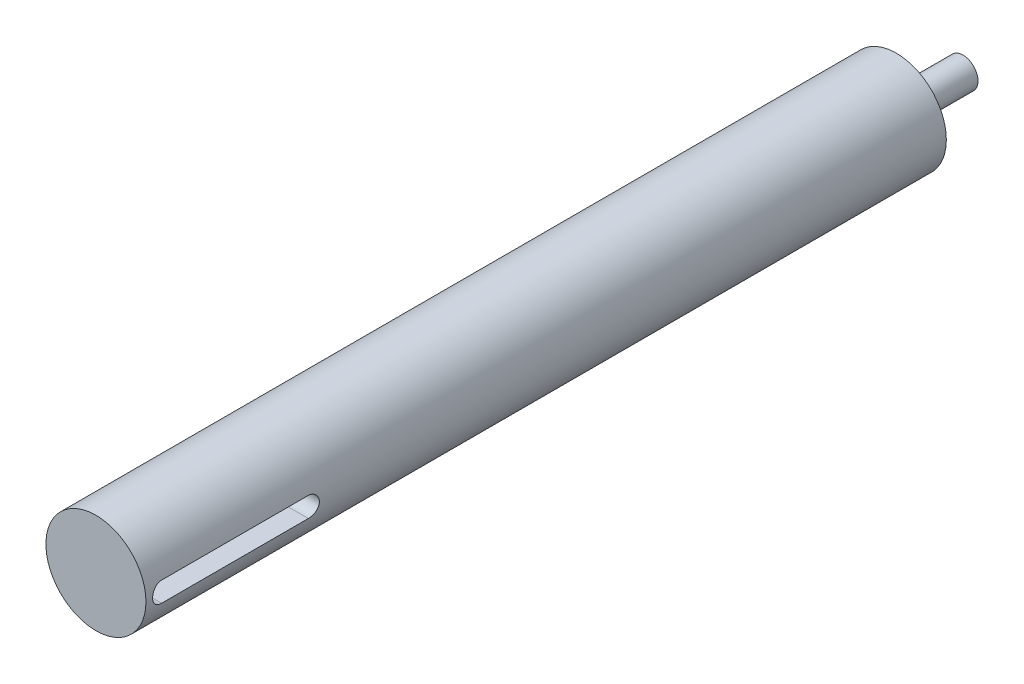
ISO-10303-21;
HEADER;
FILE_DESCRIPTION(('STEP AP214'),'2;1');
FILE_NAME('part.step','',(''),(''),'','','');
FILE_SCHEMA(('AUTOMOTIVE_DESIGN { 1 0 10303 214 1 1 1 1 }'));
ENDSEC;
DATA;
#1=APPLICATION_CONTEXT('core data for automotive mechanical design processes');
#2=APPLICATION_PROTOCOL_DEFINITION('international standard','automotive_design',2000,#1);
#3=PRODUCT_CONTEXT('',#1,'mechanical');
#4=PRODUCT('Part','Part','',(#3));
#5=PRODUCT_RELATED_PRODUCT_CATEGORY('part','',(#4));
#6=PRODUCT_DEFINITION_FORMATION('','',#4);
#7=PRODUCT_DEFINITION_CONTEXT('part definition',#1,'design');
#8=PRODUCT_DEFINITION('design','',#6,#7);
#9=PRODUCT_DEFINITION_SHAPE('','',#8);
#10=(LENGTH_UNIT() NAMED_UNIT(*) SI_UNIT(.MILLI.,.METRE.));
#11=(NAMED_UNIT(*) PLANE_ANGLE_UNIT() SI_UNIT($,.RADIAN.));
#12=(NAMED_UNIT(*) SI_UNIT($,.STERADIAN.) SOLID_ANGLE_UNIT());
#13=UNCERTAINTY_MEASURE_WITH_UNIT(LENGTH_MEASURE(1.E-05),#10,'distance_accuracy_value','');
#14=(GEOMETRIC_REPRESENTATION_CONTEXT(3) GLOBAL_UNCERTAINTY_ASSIGNED_CONTEXT((#13)) GLOBAL_UNIT_ASSIGNED_CONTEXT((#10,
#11,#12)) REPRESENTATION_CONTEXT('',''));
#15=CARTESIAN_POINT('',(0.,0.,0.));
#16=DIRECTION('',(0.,0.,1.));
#17=DIRECTION('',(1.,0.,0.));
#18=AXIS2_PLACEMENT_3D('',#15,#16,#17);
#19=CARTESIAN_POINT('',(0.,0.,240.));
#20=DIRECTION('',(0.,0.,-1.));
#21=DIRECTION('',(-1.,0.,0.));
#22=AXIS2_PLACEMENT_3D('',#19,#20,#21);
#23=CYLINDRICAL_SURFACE('',#22,15.);
#24=DIRECTION('',(0.,0.,-1.));
#25=VECTOR('',#24,1.);
#26=CARTESIAN_POINT('',(14.6969384566991,3.,240.));
#27=LINE('',#26,#25);
#28=CARTESIAN_POINT('',(14.6969384566991,3.,235.));
#29=VERTEX_POINT('',#28);
#30=CARTESIAN_POINT('',(14.6969384566991,3.,191.));
#31=VERTEX_POINT('',#30);
#32=EDGE_CURVE('E11',#29,#31,#27,.T.);
#33=ORIENTED_EDGE('',*,*,#32,.T.);
#34=CARTESIAN_POINT('',(14.6969384566991,3.,191.));
#35=CARTESIAN_POINT('',(14.6969312244577,3.00000906327289,190.916523191421));
#36=CARTESIAN_POINT('',(14.6976495056175,2.99651591463671,190.833051389738));
#37=CARTESIAN_POINT('',(14.7004835434339,2.98259549441824,190.666721900031));
#38=CARTESIAN_POINT('',(14.7025991272148,2.97216908062491,190.583864137319));
#39=CARTESIAN_POINT('',(14.708170006848,2.94447346178657,190.419470904017));
#40=CARTESIAN_POINT('',(14.7116232616092,2.92721468106147,190.337933615104));
#41=CARTESIAN_POINT('',(14.7197622168639,2.88600721568467,190.176653587297));
#42=CARTESIAN_POINT('',(14.7244479223887,2.86205850372287,190.09691085573));
#43=CARTESIAN_POINT('',(14.7401631005323,2.78041527952091,189.861194294385));
#44=CARTESIAN_POINT('',(14.7528553636172,2.71290158046863,189.708601942043));
#45=CARTESIAN_POINT('',(14.7812320879208,2.55375565119919,189.416972617254));
#46=CARTESIAN_POINT('',(14.7969168592162,2.46212092124305,189.277937051786));
#47=CARTESIAN_POINT('',(14.829758124629,2.25594334606257,189.015329422044));
#48=CARTESIAN_POINT('',(14.8469306312349,2.14112719277711,188.891973547517));
#49=CARTESIAN_POINT('',(14.8806728038384,1.89243128558794,188.666134287562));
#50=CARTESIAN_POINT('',(14.8972423761055,1.75854858340983,188.563654136129));
#51=CARTESIAN_POINT('',(14.9280843032166,1.47408029245693,188.381633947014));
#52=CARTESIAN_POINT('',(14.9423354158867,1.32335950974471,188.302301266383));
#53=CARTESIAN_POINT('',(14.9667526662081,1.01040357091221,188.170172172356));
#54=CARTESIAN_POINT('',(14.9769194080515,0.84817012201618,188.117371833799));
#55=CARTESIAN_POINT('',(14.9919095326336,0.519052235967762,188.040478900317));
#56=CARTESIAN_POINT('',(14.996801475465,0.352257106220378,188.016017643794));
#57=CARTESIAN_POINT('',(15.0009276525647,0.0168596277551986,187.99534704944));
#58=CARTESIAN_POINT('',(15.0001623007697,-0.151742587839108,187.999135644606));
#59=CARTESIAN_POINT('',(14.9931130332672,-0.483426607616177,188.034578604327));
#60=CARTESIAN_POINT('',(14.9869079049386,-0.646552839896431,188.065835150575));
#61=CARTESIAN_POINT('',(14.9697652350655,-0.965196019837501,188.154695530067));
#62=CARTESIAN_POINT('',(14.9588275387594,-1.12071271847092,188.212300224935));
#63=CARTESIAN_POINT('',(14.9333186736123,-1.42086081389148,188.352591210719));
#64=CARTESIAN_POINT('',(14.918724971732,-1.5654171804367,188.43543376084));
#65=CARTESIAN_POINT('',(14.8875135488761,-1.83871931366188,188.623730810768));
#66=CARTESIAN_POINT('',(14.8708956602115,-1.96746376866397,188.729187184514));
#67=CARTESIAN_POINT('',(14.8371311210549,-2.20783861961223,188.961885084893));
#68=CARTESIAN_POINT('',(14.8199802972521,-2.31913408498718,189.089472206219));
#69=CARTESIAN_POINT('',(14.7873511834928,-2.51883269969927,189.361714275462));
#70=CARTESIAN_POINT('',(14.7718733575622,-2.60722950726484,189.506373935497));
#71=CARTESIAN_POINT('',(14.7443319012696,-2.75873986393405,189.809157214839));
#72=CARTESIAN_POINT('',(14.7322775849504,-2.82178462990343,189.96731607019));
#73=CARTESIAN_POINT('',(14.7130848318748,-2.92022129198979,190.292175893767));
#74=CARTESIAN_POINT('',(14.7059390738486,-2.95565438245299,190.458863739944));
#75=CARTESIAN_POINT('',(14.7000953157589,-2.98449881436589,190.689070450539));
#76=CARTESIAN_POINT('',(14.6989127961598,-2.99031376696653,190.751162419347));
#77=CARTESIAN_POINT('',(14.6973350216032,-2.99805949399395,190.875493592412));
#78=CARTESIAN_POINT('',(14.6969384491447,-2.99999676871397,190.937732374867));
#79=CARTESIAN_POINT('',(14.6969384566991,-3.,191.));
#80=B_SPLINE_CURVE_WITH_KNOTS('',3,(#34,#35,#36,#37,#38,#39,#40,#41,#42,#43,#44,#45,#46,#47,#48,
#49,#50,#51,#52,#53,#54,#55,#56,#57,#58,#59,#60,#61,#62,#63,#64,#65,#66,#67,#68,#69,#70,#71,#72,
#73,#74,#75,#76,#77,#78,#79),.UNSPECIFIED.,.F.,.F.,(4,2,2,2,2,2,2,2,2,2,2,2,2,2,2,2,2,2,2,2,2,2,
4),(0.,0.25034553107374,0.500660094964615,0.750594210284371,1.00052934591732,1.50000829362269,
1.99953902430941,2.50534477833303,3.01122883056534,3.52151451068937,4.03172467755666,
4.53522025544509,5.03867899358441,5.53496413269304,6.03126550223828,6.53070440104675,
7.03018470288858,7.53831354930086,8.04658297164635,8.55622223384237,9.06509969273802,
9.25212746067475,9.43884144366995),.UNSPECIFIED.);
#81=CARTESIAN_POINT('',(14.6969384566991,-3.,191.));
#82=VERTEX_POINT('',#81);
#83=EDGE_CURVE('E113',#31,#82,#80,.T.);
#84=ORIENTED_EDGE('',*,*,#83,.T.);
#85=DIRECTION('',(0.,0.,-1.));
#86=VECTOR('',#85,1.);
#87=CARTESIAN_POINT('',(14.6969384566991,-3.,240.));
#88=LINE('',#87,#86);
#89=CARTESIAN_POINT('',(14.6969384566991,-3.,235.));
#90=VERTEX_POINT('',#89);
#91=EDGE_CURVE('E45',#82,#90,#88,.F.);
#92=ORIENTED_EDGE('',*,*,#91,.T.);
#93=CARTESIAN_POINT('',(14.6969384566991,-3.,235.));
#94=CARTESIAN_POINT('',(14.6969312244577,-3.00000906327289,235.083476808579));
#95=CARTESIAN_POINT('',(14.6976495056175,-2.99651591463671,235.166948610262));
#96=CARTESIAN_POINT('',(14.7004835434339,-2.98259549441824,235.333278099969));
#97=CARTESIAN_POINT('',(14.7025991272148,-2.97216908062491,235.416135862681));
#98=CARTESIAN_POINT('',(14.708170006848,-2.94447346178657,235.580529095983));
#99=CARTESIAN_POINT('',(14.7116232616092,-2.92721468106147,235.662066384896));
#100=CARTESIAN_POINT('',(14.7197622168639,-2.88600721568467,235.823346412703));
#101=CARTESIAN_POINT('',(14.7244479223887,-2.86205850372287,235.90308914427));
#102=CARTESIAN_POINT('',(14.7401631005323,-2.78041527952091,236.138805705615));
#103=CARTESIAN_POINT('',(14.7528553636172,-2.71290158046863,236.291398057957));
#104=CARTESIAN_POINT('',(14.7812320879208,-2.55375565119919,236.583027382746));
#105=CARTESIAN_POINT('',(14.7969168592162,-2.46212092124305,236.722062948214));
#106=CARTESIAN_POINT('',(14.829758124629,-2.25594334606257,236.984670577956));
#107=CARTESIAN_POINT('',(14.8469306312349,-2.14112719277711,237.108026452483));
#108=CARTESIAN_POINT('',(14.8806728038384,-1.89243128558794,237.333865712438));
#109=CARTESIAN_POINT('',(14.8972423761055,-1.75854858340983,237.436345863871));
#110=CARTESIAN_POINT('',(14.9280843032166,-1.47408029245693,237.618366052986));
#111=CARTESIAN_POINT('',(14.9423354158867,-1.3233595097447,237.697698733617));
#112=CARTESIAN_POINT('',(14.9667526662081,-1.01040357091221,237.829827827644));
#113=CARTESIAN_POINT('',(14.9769194080515,-0.848170122016177,237.882628166201));
#114=CARTESIAN_POINT('',(14.9919095326336,-0.519052235967761,237.959521099683));
#115=CARTESIAN_POINT('',(14.996801475465,-0.352257106220377,237.983982356206));
#116=CARTESIAN_POINT('',(15.0009276525647,-0.0168596277551973,238.00465295056));
#117=CARTESIAN_POINT('',(15.0001623007697,0.151742587839109,238.000864355394));
#118=CARTESIAN_POINT('',(14.9931130332672,0.483426607616174,237.965421395673));
#119=CARTESIAN_POINT('',(14.9869079049386,0.646552839896426,237.934164849425));
#120=CARTESIAN_POINT('',(14.9697652350655,0.965196019837497,237.845304469933));
#121=CARTESIAN_POINT('',(14.9588275387594,1.12071271847091,237.787699775065));
#122=CARTESIAN_POINT('',(14.9333186736123,1.42086081389148,237.647408789281));
#123=CARTESIAN_POINT('',(14.918724971732,1.5654171804367,237.56456623916));
#124=CARTESIAN_POINT('',(14.8875135488761,1.83871931366188,237.376269189232));
#125=CARTESIAN_POINT('',(14.8708956602115,1.96746376866397,237.270812815486));
#126=CARTESIAN_POINT('',(14.8371311210549,2.20783861961223,237.038114915107));
#127=CARTESIAN_POINT('',(14.8199802972521,2.31913408498718,236.910527793781));
#128=CARTESIAN_POINT('',(14.7873511834928,2.51883269969927,236.638285724538));
#129=CARTESIAN_POINT('',(14.7718733575622,2.60722950726484,236.493626064503));
#130=CARTESIAN_POINT('',(14.7443319012696,2.75873986393405,236.190842785161));
#131=CARTESIAN_POINT('',(14.7322775849504,2.82178462990343,236.03268392981));
#132=CARTESIAN_POINT('',(14.7130848318748,2.92022129198979,235.707824106233));
#133=CARTESIAN_POINT('',(14.7059390738486,2.95565438245299,235.541136260056));
#134=CARTESIAN_POINT('',(14.7000953157589,2.98449881436589,235.310929549461));
#135=CARTESIAN_POINT('',(14.6989127961598,2.99031376696653,235.248837580653));
#136=CARTESIAN_POINT('',(14.6973350216032,2.99805949399395,235.124506407588));
#137=CARTESIAN_POINT('',(14.6969384491447,2.99999676871397,235.062267625133));
#138=CARTESIAN_POINT('',(14.6969384566991,3.,235.));
#139=B_SPLINE_CURVE_WITH_KNOTS('',3,(#93,#94,#95,#96,#97,#98,#99,#100,#101,#102,#103,#104,#105,
#106,#107,#108,#109,#110,#111,#112,#113,#114,#115,#116,#117,#118,#119,#120,#121,#122,#123,#124,
#125,#126,#127,#128,#129,#130,#131,#132,#133,#134,#135,#136,#137,#138),.UNSPECIFIED.,.F.,.F.,(4,
2,2,2,2,2,2,2,2,2,2,2,2,2,2,2,2,2,2,2,2,2,4),(0.,0.250345531073768,0.500660094964643,
0.750594210284371,1.00052934591732,1.50000829362269,1.99953902430941,2.50534477833303,
3.01122883056534,3.52151451068938,4.03172467755666,4.53522025544509,5.03867899358441,
5.53496413269304,6.03126550223828,6.53070440104675,7.03018470288857,7.53831354930086,
8.04658297164635,8.55622223384237,9.06509969273802,9.25212746067475,9.43884144366995),.UNSPECIFIED.);
#140=EDGE_CURVE('E52',#90,#29,#139,.T.);
#141=ORIENTED_EDGE('',*,*,#140,.T.);
#142=EDGE_LOOP('',(#33,#84,#92,#141));
#143=FACE_BOUND('',#142,.T.);
#144=CARTESIAN_POINT('',(0.,0.,240.));
#145=DIRECTION('',(0.,0.,1.));
#146=DIRECTION('',(1.,0.,0.));
#147=AXIS2_PLACEMENT_3D('',#144,#145,#146);
#148=CIRCLE('',#147,15.);
#149=CARTESIAN_POINT('',(15.,0.,240.));
#150=VERTEX_POINT('',#149);
#151=EDGE_CURVE('E114',#150,#150,#148,.T.);
#152=ORIENTED_EDGE('',*,*,#151,.F.);
#153=EDGE_LOOP('',(#152));
#154=FACE_BOUND('',#153,.T.);
#155=CARTESIAN_POINT('',(0.,0.,0.));
#156=DIRECTION('',(0.,0.,1.));
#157=DIRECTION('',(1.,0.,0.));
#158=AXIS2_PLACEMENT_3D('',#155,#156,#157);
#159=CIRCLE('',#158,15.);
#160=CARTESIAN_POINT('',(15.,0.,0.));
#161=VERTEX_POINT('',#160);
#162=EDGE_CURVE('E109',#161,#161,#159,.T.);
#163=ORIENTED_EDGE('',*,*,#162,.T.);
#164=EDGE_LOOP('',(#163));
#165=FACE_BOUND('',#164,.T.);
#166=ADVANCED_FACE('F37',(#143,#154,#165),#23,.T.);
#167=CARTESIAN_POINT('',(0.,0.,240.));
#168=DIRECTION('',(0.,0.,1.));
#169=DIRECTION('',(1.,0.,0.));
#170=AXIS2_PLACEMENT_3D('',#167,#168,#169);
#171=PLANE('',#170);
#172=ORIENTED_EDGE('',*,*,#151,.T.);
#173=EDGE_LOOP('',(#172));
#174=FACE_BOUND('',#173,.T.);
#175=ADVANCED_FACE('F152',(#174),#171,.T.);
#176=CARTESIAN_POINT('',(0.,0.,0.));
#177=DIRECTION('',(0.,0.,1.));
#178=DIRECTION('',(1.,0.,0.));
#179=AXIS2_PLACEMENT_3D('',#176,#177,#178);
#180=PLANE('',#179);
#181=CARTESIAN_POINT('',(0.,0.,0.));
#182=DIRECTION('',(0.,0.,-1.));
#183=DIRECTION('',(-1.,0.,0.));
#184=AXIS2_PLACEMENT_3D('',#181,#182,#183);
#185=CIRCLE('',#184,4.5);
#186=CARTESIAN_POINT('',(-4.5,0.,0.));
#187=VERTEX_POINT('',#186);
#188=EDGE_CURVE('E110',#187,#187,#185,.T.);
#189=ORIENTED_EDGE('',*,*,#188,.F.);
#190=EDGE_LOOP('',(#189));
#191=FACE_BOUND('',#190,.T.);
#192=ORIENTED_EDGE('',*,*,#162,.F.);
#193=EDGE_LOOP('',(#192));
#194=FACE_BOUND('',#193,.T.);
#195=ADVANCED_FACE('F150',(#191,#194),#180,.F.);
#196=CARTESIAN_POINT('',(0.,0.,-20.));
#197=DIRECTION('',(0.,0.,1.));
#198=DIRECTION('',(1.,0.,0.));
#199=AXIS2_PLACEMENT_3D('',#196,#197,#198);
#200=CYLINDRICAL_SURFACE('',#199,4.5);
#201=CARTESIAN_POINT('',(0.,0.,-20.));
#202=DIRECTION('',(0.,0.,-1.));
#203=DIRECTION('',(-1.,0.,0.));
#204=AXIS2_PLACEMENT_3D('',#201,#202,#203);
#205=CIRCLE('',#204,4.5);
#206=CARTESIAN_POINT('',(-4.5,0.,-20.));
#207=VERTEX_POINT('',#206);
#208=EDGE_CURVE('E103',#207,#207,#205,.T.);
#209=ORIENTED_EDGE('',*,*,#208,.F.);
#210=EDGE_LOOP('',(#209));
#211=FACE_BOUND('',#210,.T.);
#212=ORIENTED_EDGE('',*,*,#188,.T.);
#213=EDGE_LOOP('',(#212));
#214=FACE_BOUND('',#213,.T.);
#215=ADVANCED_FACE('F146',(#211,#214),#200,.T.);
#216=CARTESIAN_POINT('',(0.,0.,-20.));
#217=DIRECTION('',(0.,0.,-1.));
#218=DIRECTION('',(-1.,0.,0.));
#219=AXIS2_PLACEMENT_3D('',#216,#217,#218);
#220=PLANE('',#219);
#221=ORIENTED_EDGE('',*,*,#208,.T.);
#222=EDGE_LOOP('',(#221));
#223=FACE_BOUND('',#222,.T.);
#224=ADVANCED_FACE('F143',(#223),#220,.T.);
#225=CARTESIAN_POINT('',(7.,0.,235.));
#226=DIRECTION('',(1.,0.,0.));
#227=DIRECTION('',(0.,0.,-1.));
#228=AXIS2_PLACEMENT_3D('',#225,#226,#227);
#229=CYLINDRICAL_SURFACE('',#228,3.);
#230=DIRECTION('',(1.,0.,0.));
#231=VECTOR('',#230,1.);
#232=CARTESIAN_POINT('',(7.,-3.,235.));
#233=LINE('',#232,#231);
#234=CARTESIAN_POINT('',(7.,-3.,235.));
#235=VERTEX_POINT('',#234);
#236=EDGE_CURVE('E75',#235,#90,#233,.T.);
#237=ORIENTED_EDGE('',*,*,#236,.F.);
#238=CARTESIAN_POINT('',(7.,0.,235.));
#239=DIRECTION('',(1.,0.,0.));
#240=DIRECTION('',(0.,0.,-1.));
#241=AXIS2_PLACEMENT_3D('',#238,#239,#240);
#242=CIRCLE('',#241,3.);
#243=CARTESIAN_POINT('',(7.,3.,235.));
#244=VERTEX_POINT('',#243);
#245=EDGE_CURVE('E79',#244,#235,#242,.T.);
#246=ORIENTED_EDGE('',*,*,#245,.F.);
#247=DIRECTION('',(1.,0.,0.));
#248=VECTOR('',#247,1.);
#249=CARTESIAN_POINT('',(7.,3.,235.));
#250=LINE('',#249,#248);
#251=EDGE_CURVE('E101',#244,#29,#250,.T.);
#252=ORIENTED_EDGE('',*,*,#251,.T.);
#253=ORIENTED_EDGE('',*,*,#140,.F.);
#254=EDGE_LOOP('',(#237,#246,#252,#253));
#255=FACE_BOUND('',#254,.T.);
#256=ADVANCED_FACE('F77',(#255),#229,.F.);
#257=CARTESIAN_POINT('',(7.,3.,235.));
#258=DIRECTION('',(0.,1.,0.));
#259=DIRECTION('',(0.,0.,1.));
#260=AXIS2_PLACEMENT_3D('',#257,#258,#259);
#261=PLANE('',#260);
#262=ORIENTED_EDGE('',*,*,#251,.F.);
#263=DIRECTION('',(0.,0.,1.));
#264=VECTOR('',#263,1.);
#265=CARTESIAN_POINT('',(7.,3.,235.));
#266=LINE('',#265,#264);
#267=CARTESIAN_POINT('',(7.,3.,191.));
#268=VERTEX_POINT('',#267);
#269=EDGE_CURVE('E84',#268,#244,#266,.T.);
#270=ORIENTED_EDGE('',*,*,#269,.F.);
#271=DIRECTION('',(1.,0.,0.));
#272=VECTOR('',#271,1.);
#273=CARTESIAN_POINT('',(7.,3.,191.));
#274=LINE('',#273,#272);
#275=EDGE_CURVE('E104',#268,#31,#274,.T.);
#276=ORIENTED_EDGE('',*,*,#275,.T.);
#277=ORIENTED_EDGE('',*,*,#32,.F.);
#278=EDGE_LOOP('',(#262,#270,#276,#277));
#279=FACE_BOUND('',#278,.T.);
#280=ADVANCED_FACE('F136',(#279),#261,.F.);
#281=CARTESIAN_POINT('',(7.,0.,191.));
#282=DIRECTION('',(1.,0.,0.));
#283=DIRECTION('',(0.,0.,-1.));
#284=AXIS2_PLACEMENT_3D('',#281,#282,#283);
#285=CYLINDRICAL_SURFACE('',#284,3.);
#286=ORIENTED_EDGE('',*,*,#275,.F.);
#287=CARTESIAN_POINT('',(7.,0.,191.));
#288=DIRECTION('',(1.,0.,0.));
#289=DIRECTION('',(0.,0.,-1.));
#290=AXIS2_PLACEMENT_3D('',#287,#288,#289);
#291=CIRCLE('',#290,3.);
#292=CARTESIAN_POINT('',(7.,-3.,191.));
#293=VERTEX_POINT('',#292);
#294=EDGE_CURVE('E93',#293,#268,#291,.T.);
#295=ORIENTED_EDGE('',*,*,#294,.F.);
#296=DIRECTION('',(1.,0.,0.));
#297=VECTOR('',#296,1.);
#298=CARTESIAN_POINT('',(7.,-3.,191.));
#299=LINE('',#298,#297);
#300=EDGE_CURVE('E83',#293,#82,#299,.T.);
#301=ORIENTED_EDGE('',*,*,#300,.T.);
#302=ORIENTED_EDGE('',*,*,#83,.F.);
#303=EDGE_LOOP('',(#286,#295,#301,#302));
#304=FACE_BOUND('',#303,.T.);
#305=ADVANCED_FACE('F131',(#304),#285,.F.);
#306=CARTESIAN_POINT('',(7.,-3.,235.));
#307=DIRECTION('',(0.,-1.,0.));
#308=DIRECTION('',(0.,0.,-1.));
#309=AXIS2_PLACEMENT_3D('',#306,#307,#308);
#310=PLANE('',#309);
#311=ORIENTED_EDGE('',*,*,#300,.F.);
#312=DIRECTION('',(0.,0.,-1.));
#313=VECTOR('',#312,1.);
#314=CARTESIAN_POINT('',(7.,-3.,235.));
#315=LINE('',#314,#313);
#316=EDGE_CURVE('E87',#235,#293,#315,.T.);
#317=ORIENTED_EDGE('',*,*,#316,.F.);
#318=ORIENTED_EDGE('',*,*,#236,.T.);
#319=ORIENTED_EDGE('',*,*,#91,.F.);
#320=EDGE_LOOP('',(#311,#317,#318,#319));
#321=FACE_BOUND('',#320,.T.);
#322=ADVANCED_FACE('F88',(#321),#310,.F.);
#323=CARTESIAN_POINT('',(7.,0.,235.));
#324=DIRECTION('',(1.,0.,0.));
#325=DIRECTION('',(0.,0.,-1.));
#326=AXIS2_PLACEMENT_3D('',#323,#324,#325);
#327=PLANE('',#326);
#328=ORIENTED_EDGE('',*,*,#245,.T.);
#329=ORIENTED_EDGE('',*,*,#316,.T.);
#330=ORIENTED_EDGE('',*,*,#294,.T.);
#331=ORIENTED_EDGE('',*,*,#269,.T.);
#332=EDGE_LOOP('',(#328,#329,#330,#331));
#333=FACE_BOUND('',#332,.T.);
#334=ADVANCED_FACE('F95',(#333),#327,.T.);
#335=CLOSED_SHELL('',(#166,#175,#195,#215,#224,#256,#280,#305,#322,#334));
#336=MANIFOLD_SOLID_BREP('B2',#335);
#337=ADVANCED_BREP_SHAPE_REPRESENTATION('',(#18,#336),#14);
#338=SHAPE_DEFINITION_REPRESENTATION(#9,#337);
ENDSEC;
END-ISO-10303-21;
